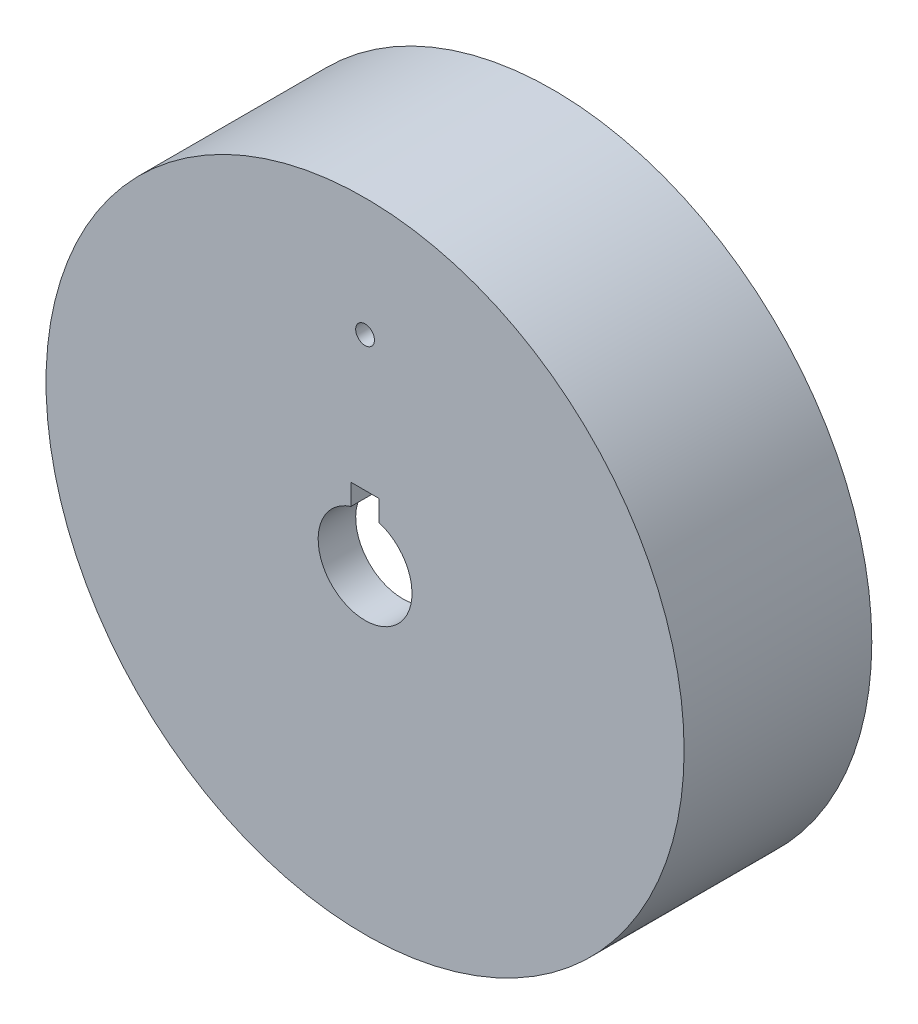
ISO-10303-21;
HEADER;
FILE_DESCRIPTION(('STEP AP214'),'2;1');
FILE_NAME('part.step','',(''),(''),'','','');
FILE_SCHEMA(('AUTOMOTIVE_DESIGN { 1 0 10303 214 1 1 1 1 }'));
ENDSEC;
DATA;
#1=APPLICATION_CONTEXT('core data for automotive mechanical design processes');
#2=APPLICATION_PROTOCOL_DEFINITION('international standard','automotive_design',2000,#1);
#3=PRODUCT_CONTEXT('',#1,'mechanical');
#4=PRODUCT('Part','Part','',(#3));
#5=PRODUCT_RELATED_PRODUCT_CATEGORY('part','',(#4));
#6=PRODUCT_DEFINITION_FORMATION('','',#4);
#7=PRODUCT_DEFINITION_CONTEXT('part definition',#1,'design');
#8=PRODUCT_DEFINITION('design','',#6,#7);
#9=PRODUCT_DEFINITION_SHAPE('','',#8);
#10=(LENGTH_UNIT() NAMED_UNIT(*) SI_UNIT(.MILLI.,.METRE.));
#11=(NAMED_UNIT(*) PLANE_ANGLE_UNIT() SI_UNIT($,.RADIAN.));
#12=(NAMED_UNIT(*) SI_UNIT($,.STERADIAN.) SOLID_ANGLE_UNIT());
#13=UNCERTAINTY_MEASURE_WITH_UNIT(LENGTH_MEASURE(1.E-05),#10,'distance_accuracy_value','');
#14=(GEOMETRIC_REPRESENTATION_CONTEXT(3) GLOBAL_UNCERTAINTY_ASSIGNED_CONTEXT((#13)) GLOBAL_UNIT_ASSIGNED_CONTEXT((#10,
#11,#12)) REPRESENTATION_CONTEXT('',''));
#15=CARTESIAN_POINT('',(0.,0.,0.));
#16=DIRECTION('',(0.,0.,1.));
#17=DIRECTION('',(1.,0.,0.));
#18=AXIS2_PLACEMENT_3D('',#15,#16,#17);
#19=CARTESIAN_POINT('',(0.,0.,100.));
#20=DIRECTION('',(0.,0.,-1.));
#21=DIRECTION('',(-1.,0.,0.));
#22=AXIS2_PLACEMENT_3D('',#19,#20,#21);
#23=CYLINDRICAL_SURFACE('',#22,25.);
#24=CARTESIAN_POINT('',(0.,0.,80.));
#25=DIRECTION('',(0.,0.,1.));
#26=DIRECTION('',(1.,0.,0.));
#27=AXIS2_PLACEMENT_3D('',#24,#25,#26);
#28=CIRCLE('',#27,25.);
#29=CARTESIAN_POINT('',(-7.50000000000001,23.8484800354236,80.));
#30=VERTEX_POINT('',#29);
#31=CARTESIAN_POINT('',(7.5,23.8484800354236,80.));
#32=VERTEX_POINT('',#31);
#33=EDGE_CURVE('E118',#30,#32,#28,.T.);
#34=ORIENTED_EDGE('',*,*,#33,.F.);
#35=DIRECTION('',(0.,0.,-1.));
#36=VECTOR('',#35,1.);
#37=CARTESIAN_POINT('',(-7.50000000000001,23.8484800354236,100.));
#38=LINE('',#37,#36);
#39=CARTESIAN_POINT('',(-7.50000000000001,23.8484800354236,100.));
#40=VERTEX_POINT('',#39);
#41=EDGE_CURVE('E62',#30,#40,#38,.F.);
#42=ORIENTED_EDGE('',*,*,#41,.T.);
#43=CARTESIAN_POINT('',(0.,0.,100.));
#44=DIRECTION('',(0.,0.,1.));
#45=DIRECTION('',(1.,0.,0.));
#46=AXIS2_PLACEMENT_3D('',#43,#44,#45);
#47=CIRCLE('',#46,25.);
#48=CARTESIAN_POINT('',(7.5,23.8484800354236,100.));
#49=VERTEX_POINT('',#48);
#50=EDGE_CURVE('E122',#40,#49,#47,.T.);
#51=ORIENTED_EDGE('',*,*,#50,.T.);
#52=DIRECTION('',(0.,0.,-1.));
#53=VECTOR('',#52,1.);
#54=CARTESIAN_POINT('',(7.5,23.8484800354236,100.));
#55=LINE('',#54,#53);
#56=EDGE_CURVE('E87',#49,#32,#55,.T.);
#57=ORIENTED_EDGE('',*,*,#56,.T.);
#58=EDGE_LOOP('',(#34,#42,#51,#57));
#59=FACE_BOUND('',#58,.T.);
#60=ADVANCED_FACE('F41',(#59),#23,.F.);
#61=CARTESIAN_POINT('',(0.,0.,100.));
#62=DIRECTION('',(0.,0.,1.));
#63=DIRECTION('',(1.,0.,0.));
#64=AXIS2_PLACEMENT_3D('',#61,#62,#63);
#65=PLANE('',#64);
#66=CARTESIAN_POINT('',(0.,106.839777093105,100.));
#67=DIRECTION('',(0.,0.,-1.));
#68=DIRECTION('',(-1.,0.,0.));
#69=AXIS2_PLACEMENT_3D('',#66,#67,#68);
#70=CIRCLE('',#69,5.);
#71=CARTESIAN_POINT('',(-5.,106.839777093105,100.));
#72=VERTEX_POINT('',#71);
#73=EDGE_CURVE('E135',#72,#72,#70,.T.);
#74=ORIENTED_EDGE('',*,*,#73,.T.);
#75=EDGE_LOOP('',(#74));
#76=FACE_BOUND('',#75,.T.);
#77=CARTESIAN_POINT('',(0.,0.,100.));
#78=DIRECTION('',(0.,0.,1.));
#79=DIRECTION('',(1.,0.,0.));
#80=AXIS2_PLACEMENT_3D('',#77,#78,#79);
#81=CIRCLE('',#80,170.);
#82=CARTESIAN_POINT('',(170.,0.,100.));
#83=VERTEX_POINT('',#82);
#84=EDGE_CURVE('E119',#83,#83,#81,.T.);
#85=ORIENTED_EDGE('',*,*,#84,.T.);
#86=EDGE_LOOP('',(#85));
#87=FACE_BOUND('',#86,.T.);
#88=ORIENTED_EDGE('',*,*,#50,.F.);
#89=DIRECTION('',(0.,-1.,0.));
#90=VECTOR('',#89,1.);
#91=CARTESIAN_POINT('',(-7.50000000000001,0.,100.));
#92=LINE('',#91,#90);
#93=CARTESIAN_POINT('',(-7.50000000000001,35.,100.));
#94=VERTEX_POINT('',#93);
#95=EDGE_CURVE('E93',#94,#40,#92,.T.);
#96=ORIENTED_EDGE('',*,*,#95,.F.);
#97=DIRECTION('',(-1.,0.,0.));
#98=VECTOR('',#97,1.);
#99=CARTESIAN_POINT('',(-7.50000000000001,35.,100.));
#100=LINE('',#99,#98);
#101=CARTESIAN_POINT('',(7.49999999999999,35.,100.));
#102=VERTEX_POINT('',#101);
#103=EDGE_CURVE('E92',#102,#94,#100,.T.);
#104=ORIENTED_EDGE('',*,*,#103,.F.);
#105=DIRECTION('',(0.,1.,0.));
#106=VECTOR('',#105,1.);
#107=CARTESIAN_POINT('',(7.50000000000001,0.,100.));
#108=LINE('',#107,#106);
#109=EDGE_CURVE('E81',#49,#102,#108,.T.);
#110=ORIENTED_EDGE('',*,*,#109,.F.);
#111=EDGE_LOOP('',(#88,#96,#104,#110));
#112=FACE_BOUND('',#111,.T.);
#113=ADVANCED_FACE('F100',(#76,#87,#112),#65,.T.);
#114=CARTESIAN_POINT('',(0.,0.,80.));
#115=DIRECTION('',(0.,0.,1.));
#116=DIRECTION('',(1.,0.,0.));
#117=AXIS2_PLACEMENT_3D('',#114,#115,#116);
#118=PLANE('',#117);
#119=CARTESIAN_POINT('',(0.,0.,80.));
#120=DIRECTION('',(0.,0.,1.));
#121=DIRECTION('',(1.,0.,0.));
#122=AXIS2_PLACEMENT_3D('',#119,#120,#121);
#123=CIRCLE('',#122,67.5);
#124=CARTESIAN_POINT('',(67.5,0.,80.));
#125=VERTEX_POINT('',#124);
#126=EDGE_CURVE('E107',#125,#125,#123,.T.);
#127=ORIENTED_EDGE('',*,*,#126,.F.);
#128=EDGE_LOOP('',(#127));
#129=FACE_BOUND('',#128,.T.);
#130=DIRECTION('',(0.,1.,0.));
#131=VECTOR('',#130,1.);
#132=CARTESIAN_POINT('',(-7.50000000000001,0.,80.));
#133=LINE('',#132,#131);
#134=CARTESIAN_POINT('',(-7.50000000000001,35.,80.));
#135=VERTEX_POINT('',#134);
#136=EDGE_CURVE('E11',#30,#135,#133,.T.);
#137=ORIENTED_EDGE('',*,*,#136,.F.);
#138=ORIENTED_EDGE('',*,*,#33,.T.);
#139=DIRECTION('',(0.,-1.,0.));
#140=VECTOR('',#139,1.);
#141=CARTESIAN_POINT('',(7.50000000000001,0.,80.));
#142=LINE('',#141,#140);
#143=CARTESIAN_POINT('',(7.49999999999999,35.,80.));
#144=VERTEX_POINT('',#143);
#145=EDGE_CURVE('E49',#144,#32,#142,.T.);
#146=ORIENTED_EDGE('',*,*,#145,.F.);
#147=DIRECTION('',(1.,0.,0.));
#148=VECTOR('',#147,1.);
#149=CARTESIAN_POINT('',(0.,35.,80.));
#150=LINE('',#149,#148);
#151=EDGE_CURVE('E97',#135,#144,#150,.T.);
#152=ORIENTED_EDGE('',*,*,#151,.F.);
#153=EDGE_LOOP('',(#137,#138,#146,#152));
#154=FACE_BOUND('',#153,.T.);
#155=ADVANCED_FACE('F133',(#129,#154),#118,.F.);
#156=CARTESIAN_POINT('',(0.,0.,100.));
#157=DIRECTION('',(0.,0.,-1.));
#158=DIRECTION('',(-1.,0.,0.));
#159=AXIS2_PLACEMENT_3D('',#156,#157,#158);
#160=CYLINDRICAL_SURFACE('',#159,170.);
#161=ORIENTED_EDGE('',*,*,#84,.F.);
#162=EDGE_LOOP('',(#161));
#163=FACE_BOUND('',#162,.T.);
#164=CARTESIAN_POINT('',(0.,0.,0.));
#165=DIRECTION('',(0.,0.,1.));
#166=DIRECTION('',(1.,0.,0.));
#167=AXIS2_PLACEMENT_3D('',#164,#165,#166);
#168=CIRCLE('',#167,170.);
#169=CARTESIAN_POINT('',(170.,0.,0.));
#170=VERTEX_POINT('',#169);
#171=EDGE_CURVE('E114',#170,#170,#168,.T.);
#172=ORIENTED_EDGE('',*,*,#171,.T.);
#173=EDGE_LOOP('',(#172));
#174=FACE_BOUND('',#173,.T.);
#175=ADVANCED_FACE('F43',(#163,#174),#160,.T.);
#176=CARTESIAN_POINT('',(0.,0.,0.));
#177=DIRECTION('',(0.,0.,1.));
#178=DIRECTION('',(1.,0.,0.));
#179=AXIS2_PLACEMENT_3D('',#176,#177,#178);
#180=PLANE('',#179);
#181=CARTESIAN_POINT('',(0.,0.,0.));
#182=DIRECTION('',(0.,0.,1.));
#183=DIRECTION('',(1.,0.,0.));
#184=AXIS2_PLACEMENT_3D('',#181,#182,#183);
#185=CIRCLE('',#184,150.);
#186=CARTESIAN_POINT('',(150.,0.,0.));
#187=VERTEX_POINT('',#186);
#188=EDGE_CURVE('E115',#187,#187,#185,.T.);
#189=ORIENTED_EDGE('',*,*,#188,.T.);
#190=EDGE_LOOP('',(#189));
#191=FACE_BOUND('',#190,.T.);
#192=ORIENTED_EDGE('',*,*,#171,.F.);
#193=EDGE_LOOP('',(#192));
#194=FACE_BOUND('',#193,.T.);
#195=ADVANCED_FACE('F160',(#191,#194),#180,.F.);
#196=CARTESIAN_POINT('',(0.,0.,50.));
#197=DIRECTION('',(0.,0.,-1.));
#198=DIRECTION('',(-1.,0.,0.));
#199=AXIS2_PLACEMENT_3D('',#196,#197,#198);
#200=CYLINDRICAL_SURFACE('',#199,150.);
#201=CARTESIAN_POINT('',(0.,0.,50.));
#202=DIRECTION('',(0.,0.,1.));
#203=DIRECTION('',(1.,0.,0.));
#204=AXIS2_PLACEMENT_3D('',#201,#202,#203);
#205=CIRCLE('',#204,150.);
#206=CARTESIAN_POINT('',(150.,0.,50.));
#207=VERTEX_POINT('',#206);
#208=EDGE_CURVE('E111',#207,#207,#205,.T.);
#209=ORIENTED_EDGE('',*,*,#208,.T.);
#210=EDGE_LOOP('',(#209));
#211=FACE_BOUND('',#210,.T.);
#212=ORIENTED_EDGE('',*,*,#188,.F.);
#213=EDGE_LOOP('',(#212));
#214=FACE_BOUND('',#213,.T.);
#215=ADVANCED_FACE('F152',(#211,#214),#200,.F.);
#216=CARTESIAN_POINT('',(0.,0.,50.));
#217=DIRECTION('',(0.,0.,1.));
#218=DIRECTION('',(1.,0.,0.));
#219=AXIS2_PLACEMENT_3D('',#216,#217,#218);
#220=PLANE('',#219);
#221=CARTESIAN_POINT('',(0.,106.839777093105,50.));
#222=DIRECTION('',(0.,0.,-1.));
#223=DIRECTION('',(-1.,0.,0.));
#224=AXIS2_PLACEMENT_3D('',#221,#222,#223);
#225=CIRCLE('',#224,8.65);
#226=CARTESIAN_POINT('',(-8.65,106.839777093105,50.));
#227=VERTEX_POINT('',#226);
#228=EDGE_CURVE('E142',#227,#227,#225,.T.);
#229=ORIENTED_EDGE('',*,*,#228,.F.);
#230=EDGE_LOOP('',(#229));
#231=FACE_BOUND('',#230,.T.);
#232=CARTESIAN_POINT('',(0.,0.,50.));
#233=DIRECTION('',(0.,0.,1.));
#234=DIRECTION('',(1.,0.,0.));
#235=AXIS2_PLACEMENT_3D('',#232,#233,#234);
#236=CIRCLE('',#235,67.5);
#237=CARTESIAN_POINT('',(67.5,0.,50.));
#238=VERTEX_POINT('',#237);
#239=EDGE_CURVE('E110',#238,#238,#236,.F.);
#240=ORIENTED_EDGE('',*,*,#239,.F.);
#241=EDGE_LOOP('',(#240));
#242=FACE_BOUND('',#241,.T.);
#243=ORIENTED_EDGE('',*,*,#208,.F.);
#244=EDGE_LOOP('',(#243));
#245=FACE_BOUND('',#244,.T.);
#246=ADVANCED_FACE('F148',(#231,#242,#245),#220,.F.);
#247=CARTESIAN_POINT('',(0.,0.,80.));
#248=DIRECTION('',(0.,0.,-1.));
#249=DIRECTION('',(-1.,0.,0.));
#250=AXIS2_PLACEMENT_3D('',#247,#248,#249);
#251=CYLINDRICAL_SURFACE('',#250,67.5);
#252=ORIENTED_EDGE('',*,*,#126,.T.);
#253=EDGE_LOOP('',(#252));
#254=FACE_BOUND('',#253,.T.);
#255=ORIENTED_EDGE('',*,*,#239,.T.);
#256=EDGE_LOOP('',(#255));
#257=FACE_BOUND('',#256,.T.);
#258=ADVANCED_FACE('F151',(#254,#257),#251,.F.);
#259=CARTESIAN_POINT('',(-7.50000000000001,35.,100.));
#260=DIRECTION('',(0.,-1.,0.));
#261=DIRECTION('',(0.,0.,-1.));
#262=AXIS2_PLACEMENT_3D('',#259,#260,#261);
#263=PLANE('',#262);
#264=ORIENTED_EDGE('',*,*,#151,.T.);
#265=DIRECTION('',(0.,0.,-1.));
#266=VECTOR('',#265,1.);
#267=CARTESIAN_POINT('',(7.49999999999999,35.,100.));
#268=LINE('',#267,#266);
#269=EDGE_CURVE('E84',#102,#144,#268,.T.);
#270=ORIENTED_EDGE('',*,*,#269,.F.);
#271=ORIENTED_EDGE('',*,*,#103,.T.);
#272=DIRECTION('',(0.,0.,-1.));
#273=VECTOR('',#272,1.);
#274=CARTESIAN_POINT('',(-7.50000000000001,35.,100.));
#275=LINE('',#274,#273);
#276=EDGE_CURVE('E56',#94,#135,#275,.T.);
#277=ORIENTED_EDGE('',*,*,#276,.T.);
#278=EDGE_LOOP('',(#264,#270,#271,#277));
#279=FACE_BOUND('',#278,.T.);
#280=ADVANCED_FACE('F95',(#279),#263,.T.);
#281=CARTESIAN_POINT('',(-7.50000000000001,0.,100.));
#282=DIRECTION('',(1.,0.,0.));
#283=DIRECTION('',(0.,1.,0.));
#284=AXIS2_PLACEMENT_3D('',#281,#282,#283);
#285=PLANE('',#284);
#286=ORIENTED_EDGE('',*,*,#136,.T.);
#287=ORIENTED_EDGE('',*,*,#276,.F.);
#288=ORIENTED_EDGE('',*,*,#95,.T.);
#289=ORIENTED_EDGE('',*,*,#41,.F.);
#290=EDGE_LOOP('',(#286,#287,#288,#289));
#291=FACE_BOUND('',#290,.T.);
#292=ADVANCED_FACE('F134',(#291),#285,.T.);
#293=CARTESIAN_POINT('',(7.50000000000001,0.,100.));
#294=DIRECTION('',(-1.,0.,0.));
#295=DIRECTION('',(0.,-1.,0.));
#296=AXIS2_PLACEMENT_3D('',#293,#294,#295);
#297=PLANE('',#296);
#298=ORIENTED_EDGE('',*,*,#109,.T.);
#299=ORIENTED_EDGE('',*,*,#269,.T.);
#300=ORIENTED_EDGE('',*,*,#145,.T.);
#301=ORIENTED_EDGE('',*,*,#56,.F.);
#302=EDGE_LOOP('',(#298,#299,#300,#301));
#303=FACE_BOUND('',#302,.T.);
#304=ADVANCED_FACE('F83',(#303),#297,.T.);
#305=CARTESIAN_POINT('',(0.,106.839777093105,50.));
#306=DIRECTION('',(0.,0.,-1.));
#307=DIRECTION('',(-1.,0.,0.));
#308=AXIS2_PLACEMENT_3D('',#305,#306,#307);
#309=CYLINDRICAL_SURFACE('',#308,5.);
#310=ORIENTED_EDGE('',*,*,#73,.F.);
#311=EDGE_LOOP('',(#310));
#312=FACE_BOUND('',#311,.T.);
#313=CARTESIAN_POINT('',(0.,106.839777093105,53.65));
#314=DIRECTION('',(0.,0.,-1.));
#315=DIRECTION('',(-1.,0.,0.));
#316=AXIS2_PLACEMENT_3D('',#313,#314,#315);
#317=CIRCLE('',#316,4.99999999999999);
#318=CARTESIAN_POINT('',(-4.99999999999999,106.839777093105,53.65));
#319=VERTEX_POINT('',#318);
#320=EDGE_CURVE('E137',#319,#319,#317,.T.);
#321=ORIENTED_EDGE('',*,*,#320,.T.);
#322=EDGE_LOOP('',(#321));
#323=FACE_BOUND('',#322,.T.);
#324=ADVANCED_FACE('F191',(#312,#323),#309,.F.);
#325=CARTESIAN_POINT('',(0.,106.839777093105,50.));
#326=DIRECTION('',(0.,0.,-1.));
#327=DIRECTION('',(-1.,0.,0.));
#328=AXIS2_PLACEMENT_3D('',#325,#326,#327);
#329=CONICAL_SURFACE('',#328,8.65,0.785398163397449);
#330=ORIENTED_EDGE('',*,*,#320,.F.);
#331=EDGE_LOOP('',(#330));
#332=FACE_BOUND('',#331,.T.);
#333=ORIENTED_EDGE('',*,*,#228,.T.);
#334=EDGE_LOOP('',(#333));
#335=FACE_BOUND('',#334,.T.);
#336=ADVANCED_FACE('F146',(#332,#335),#329,.F.);
#337=CLOSED_SHELL('',(#60,#113,#155,#175,#195,#215,#246,#258,#280,#292,#304,#324,#336));
#338=MANIFOLD_SOLID_BREP('B2',#337);
#339=ADVANCED_BREP_SHAPE_REPRESENTATION('',(#18,#338),#14);
#340=SHAPE_DEFINITION_REPRESENTATION(#9,#339);
ENDSEC;
END-ISO-10303-21;
